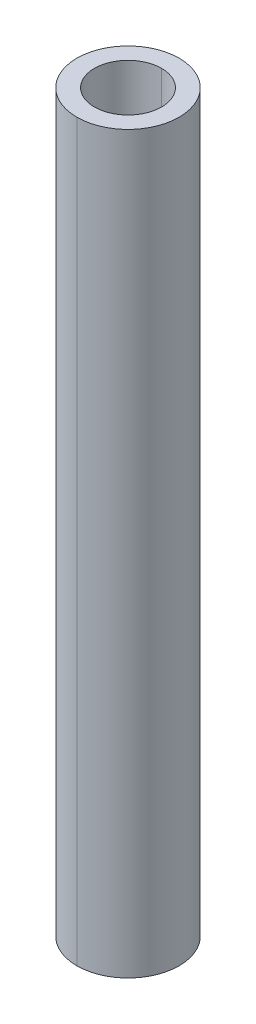
ISO-10303-21;
HEADER;
FILE_DESCRIPTION(('STEP AP214'),'2;1');
FILE_NAME('part.step','',(''),(''),'','','');
FILE_SCHEMA(('AUTOMOTIVE_DESIGN { 1 0 10303 214 1 1 1 1 }'));
ENDSEC;
DATA;
#1=APPLICATION_CONTEXT('core data for automotive mechanical design processes');
#2=APPLICATION_PROTOCOL_DEFINITION('international standard','automotive_design',2000,#1);
#3=PRODUCT_CONTEXT('',#1,'mechanical');
#4=PRODUCT('Part','Part','',(#3));
#5=PRODUCT_RELATED_PRODUCT_CATEGORY('part','',(#4));
#6=PRODUCT_DEFINITION_FORMATION('','',#4);
#7=PRODUCT_DEFINITION_CONTEXT('part definition',#1,'design');
#8=PRODUCT_DEFINITION('design','',#6,#7);
#9=PRODUCT_DEFINITION_SHAPE('','',#8);
#10=(LENGTH_UNIT() NAMED_UNIT(*) SI_UNIT(.MILLI.,.METRE.));
#11=(NAMED_UNIT(*) PLANE_ANGLE_UNIT() SI_UNIT($,.RADIAN.));
#12=(NAMED_UNIT(*) SI_UNIT($,.STERADIAN.) SOLID_ANGLE_UNIT());
#13=UNCERTAINTY_MEASURE_WITH_UNIT(LENGTH_MEASURE(1.E-05),#10,'distance_accuracy_value','');
#14=(GEOMETRIC_REPRESENTATION_CONTEXT(3) GLOBAL_UNCERTAINTY_ASSIGNED_CONTEXT((#13)) GLOBAL_UNIT_ASSIGNED_CONTEXT((#10,
#11,#12)) REPRESENTATION_CONTEXT('',''));
#15=CARTESIAN_POINT('',(0.,0.,0.));
#16=DIRECTION('',(0.,0.,1.));
#17=DIRECTION('',(1.,0.,0.));
#18=AXIS2_PLACEMENT_3D('',#15,#16,#17);
#19=CARTESIAN_POINT('',(0.,34.22396,0.));
#20=DIRECTION('',(0.,-1.,0.));
#21=DIRECTION('',(0.,0.,1.));
#22=AXIS2_PLACEMENT_3D('',#19,#20,#21);
#23=CYLINDRICAL_SURFACE('',#22,1.5621);
#24=DIRECTION('',(0.,-1.,0.));
#25=VECTOR('',#24,1.);
#26=CARTESIAN_POINT('',(0.,34.22396,-1.5621));
#27=LINE('',#26,#25);
#28=CARTESIAN_POINT('',(0.,34.22396,-1.5621));
#29=VERTEX_POINT('',#28);
#30=CARTESIAN_POINT('',(0.,0.,-1.5621));
#31=VERTEX_POINT('',#30);
#32=EDGE_CURVE('E114',#29,#31,#27,.T.);
#33=ORIENTED_EDGE('',*,*,#32,.T.);
#34=CARTESIAN_POINT('',(0.,0.,0.));
#35=DIRECTION('',(0.,-1.,0.));
#36=DIRECTION('',(0.,0.,-1.));
#37=AXIS2_PLACEMENT_3D('',#34,#35,#36);
#38=CIRCLE('',#37,1.5621);
#39=CARTESIAN_POINT('',(0.,0.,1.5621));
#40=VERTEX_POINT('',#39);
#41=EDGE_CURVE('E11',#31,#40,#38,.T.);
#42=ORIENTED_EDGE('',*,*,#41,.T.);
#43=DIRECTION('',(0.,-1.,0.));
#44=VECTOR('',#43,1.);
#45=CARTESIAN_POINT('',(0.,34.22396,1.56210000000002));
#46=LINE('',#45,#44);
#47=CARTESIAN_POINT('',(0.,34.22396,1.5621));
#48=VERTEX_POINT('',#47);
#49=EDGE_CURVE('E112',#48,#40,#46,.T.);
#50=ORIENTED_EDGE('',*,*,#49,.F.);
#51=CARTESIAN_POINT('',(0.,34.22396,0.));
#52=DIRECTION('',(0.,-1.,0.));
#53=DIRECTION('',(0.,0.,-1.));
#54=AXIS2_PLACEMENT_3D('',#51,#52,#53);
#55=CIRCLE('',#54,1.5621);
#56=EDGE_CURVE('E54',#29,#48,#55,.T.);
#57=ORIENTED_EDGE('',*,*,#56,.F.);
#58=EDGE_LOOP('',(#33,#42,#50,#57));
#59=FACE_BOUND('',#58,.T.);
#60=ADVANCED_FACE('F51',(#59),#23,.F.);
#61=CARTESIAN_POINT('',(0.,34.22396,0.));
#62=DIRECTION('',(0.,-1.,0.));
#63=DIRECTION('',(0.,0.,1.));
#64=AXIS2_PLACEMENT_3D('',#61,#62,#63);
#65=CYLINDRICAL_SURFACE('',#64,2.38125);
#66=DIRECTION('',(0.,-1.,0.));
#67=VECTOR('',#66,1.);
#68=CARTESIAN_POINT('',(0.,34.22396,-2.38125));
#69=LINE('',#68,#67);
#70=CARTESIAN_POINT('',(0.,34.22396,-2.38125));
#71=VERTEX_POINT('',#70);
#72=CARTESIAN_POINT('',(0.,0.,-2.38125));
#73=VERTEX_POINT('',#72);
#74=EDGE_CURVE('E133',#71,#73,#69,.T.);
#75=ORIENTED_EDGE('',*,*,#74,.T.);
#76=CARTESIAN_POINT('',(0.,0.,0.));
#77=DIRECTION('',(0.,-1.,0.));
#78=DIRECTION('',(0.,0.,-1.));
#79=AXIS2_PLACEMENT_3D('',#76,#77,#78);
#80=CIRCLE('',#79,2.38125);
#81=CARTESIAN_POINT('',(0.,0.,2.38125));
#82=VERTEX_POINT('',#81);
#83=EDGE_CURVE('E60',#82,#73,#80,.T.);
#84=ORIENTED_EDGE('',*,*,#83,.F.);
#85=DIRECTION('',(0.,-1.,0.));
#86=VECTOR('',#85,1.);
#87=CARTESIAN_POINT('',(0.,34.22396,2.38125000000003));
#88=LINE('',#87,#86);
#89=CARTESIAN_POINT('',(0.,34.22396,2.38125));
#90=VERTEX_POINT('',#89);
#91=EDGE_CURVE('E141',#90,#82,#88,.T.);
#92=ORIENTED_EDGE('',*,*,#91,.F.);
#93=CARTESIAN_POINT('',(0.,34.22396,0.));
#94=DIRECTION('',(0.,-1.,0.));
#95=DIRECTION('',(0.,0.,-1.));
#96=AXIS2_PLACEMENT_3D('',#93,#94,#95);
#97=CIRCLE('',#96,2.38125);
#98=EDGE_CURVE('E123',#90,#71,#97,.T.);
#99=ORIENTED_EDGE('',*,*,#98,.T.);
#100=EDGE_LOOP('',(#75,#84,#92,#99));
#101=FACE_BOUND('',#100,.T.);
#102=ADVANCED_FACE('F150',(#101),#65,.T.);
#103=CARTESIAN_POINT('',(0.,0.,0.));
#104=DIRECTION('',(0.,1.,0.));
#105=DIRECTION('',(1.,0.,0.));
#106=AXIS2_PLACEMENT_3D('',#103,#104,#105);
#107=PLANE('',#106);
#108=CARTESIAN_POINT('',(0.,0.,0.));
#109=DIRECTION('',(0.,-1.,0.));
#110=DIRECTION('',(0.,0.,-1.));
#111=AXIS2_PLACEMENT_3D('',#108,#109,#110);
#112=CIRCLE('',#111,1.5621);
#113=EDGE_CURVE('E127',#40,#31,#112,.T.);
#114=ORIENTED_EDGE('',*,*,#113,.F.);
#115=ORIENTED_EDGE('',*,*,#41,.F.);
#116=EDGE_LOOP('',(#114,#115));
#117=FACE_BOUND('',#116,.T.);
#118=ORIENTED_EDGE('',*,*,#83,.T.);
#119=CARTESIAN_POINT('',(0.,0.,0.));
#120=DIRECTION('',(0.,-1.,0.));
#121=DIRECTION('',(0.,0.,-1.));
#122=AXIS2_PLACEMENT_3D('',#119,#120,#121);
#123=CIRCLE('',#122,2.38125);
#124=EDGE_CURVE('E72',#73,#82,#123,.T.);
#125=ORIENTED_EDGE('',*,*,#124,.T.);
#126=EDGE_LOOP('',(#118,#125));
#127=FACE_BOUND('',#126,.T.);
#128=ADVANCED_FACE('F154',(#117,#127),#107,.F.);
#129=CARTESIAN_POINT('',(0.,34.22396,0.));
#130=DIRECTION('',(0.,1.,0.));
#131=DIRECTION('',(1.,0.,0.));
#132=AXIS2_PLACEMENT_3D('',#129,#130,#131);
#133=PLANE('',#132);
#134=CARTESIAN_POINT('',(0.,34.22396,0.));
#135=DIRECTION('',(0.,-1.,0.));
#136=DIRECTION('',(0.,0.,-1.));
#137=AXIS2_PLACEMENT_3D('',#134,#135,#136);
#138=CIRCLE('',#137,1.5621);
#139=EDGE_CURVE('E108',#48,#29,#138,.T.);
#140=ORIENTED_EDGE('',*,*,#139,.T.);
#141=ORIENTED_EDGE('',*,*,#56,.T.);
#142=EDGE_LOOP('',(#140,#141));
#143=FACE_BOUND('',#142,.T.);
#144=ORIENTED_EDGE('',*,*,#98,.F.);
#145=CARTESIAN_POINT('',(0.,34.22396,0.));
#146=DIRECTION('',(0.,-1.,0.));
#147=DIRECTION('',(0.,0.,-1.));
#148=AXIS2_PLACEMENT_3D('',#145,#146,#147);
#149=CIRCLE('',#148,2.38125);
#150=EDGE_CURVE('E126',#71,#90,#149,.T.);
#151=ORIENTED_EDGE('',*,*,#150,.F.);
#152=EDGE_LOOP('',(#144,#151));
#153=FACE_BOUND('',#152,.T.);
#154=ADVANCED_FACE('F119',(#143,#153),#133,.T.);
#155=CARTESIAN_POINT('',(0.,34.22396,0.));
#156=DIRECTION('',(0.,-1.,0.));
#157=DIRECTION('',(0.,0.,1.));
#158=AXIS2_PLACEMENT_3D('',#155,#156,#157);
#159=CYLINDRICAL_SURFACE('',#158,2.38125);
#160=ORIENTED_EDGE('',*,*,#150,.T.);
#161=ORIENTED_EDGE('',*,*,#91,.T.);
#162=ORIENTED_EDGE('',*,*,#124,.F.);
#163=ORIENTED_EDGE('',*,*,#74,.F.);
#164=EDGE_LOOP('',(#160,#161,#162,#163));
#165=FACE_BOUND('',#164,.T.);
#166=ADVANCED_FACE('F152',(#165),#159,.T.);
#167=CARTESIAN_POINT('',(0.,34.22396,0.));
#168=DIRECTION('',(0.,-1.,0.));
#169=DIRECTION('',(0.,0.,1.));
#170=AXIS2_PLACEMENT_3D('',#167,#168,#169);
#171=CYLINDRICAL_SURFACE('',#170,1.5621);
#172=ORIENTED_EDGE('',*,*,#139,.F.);
#173=ORIENTED_EDGE('',*,*,#49,.T.);
#174=ORIENTED_EDGE('',*,*,#113,.T.);
#175=ORIENTED_EDGE('',*,*,#32,.F.);
#176=EDGE_LOOP('',(#172,#173,#174,#175));
#177=FACE_BOUND('',#176,.T.);
#178=ADVANCED_FACE('F110',(#177),#171,.F.);
#179=CLOSED_SHELL('',(#60,#102,#128,#154,#166,#178));
#180=MANIFOLD_SOLID_BREP('B2',#179);
#181=ADVANCED_BREP_SHAPE_REPRESENTATION('',(#18,#180),#14);
#182=SHAPE_DEFINITION_REPRESENTATION(#9,#181);
ENDSEC;
END-ISO-10303-21;
